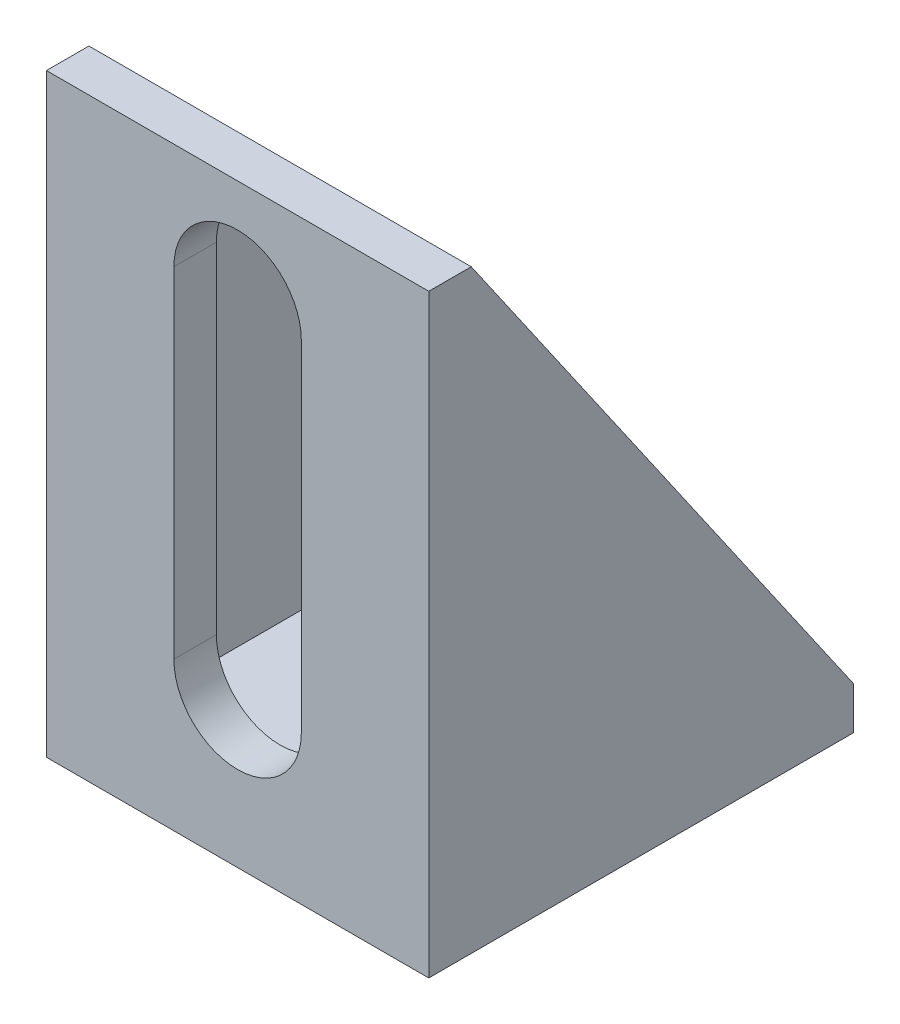
ISO-10303-21;
HEADER;
FILE_DESCRIPTION(('STEP AP214'),'2;1');
FILE_NAME('part.step','',(''),(''),'','','');
FILE_SCHEMA(('AUTOMOTIVE_DESIGN { 1 0 10303 214 1 1 1 1 }'));
ENDSEC;
DATA;
#1=APPLICATION_CONTEXT('core data for automotive mechanical design processes');
#2=APPLICATION_PROTOCOL_DEFINITION('international standard','automotive_design',2000,#1);
#3=PRODUCT_CONTEXT('',#1,'mechanical');
#4=PRODUCT('Part','Part','',(#3));
#5=PRODUCT_RELATED_PRODUCT_CATEGORY('part','',(#4));
#6=PRODUCT_DEFINITION_FORMATION('','',#4);
#7=PRODUCT_DEFINITION_CONTEXT('part definition',#1,'design');
#8=PRODUCT_DEFINITION('design','',#6,#7);
#9=PRODUCT_DEFINITION_SHAPE('','',#8);
#10=(LENGTH_UNIT() NAMED_UNIT(*) SI_UNIT(.MILLI.,.METRE.));
#11=(NAMED_UNIT(*) PLANE_ANGLE_UNIT() SI_UNIT($,.RADIAN.));
#12=(NAMED_UNIT(*) SI_UNIT($,.STERADIAN.) SOLID_ANGLE_UNIT());
#13=UNCERTAINTY_MEASURE_WITH_UNIT(LENGTH_MEASURE(1.E-05),#10,'distance_accuracy_value','');
#14=(GEOMETRIC_REPRESENTATION_CONTEXT(3) GLOBAL_UNCERTAINTY_ASSIGNED_CONTEXT((#13)) GLOBAL_UNIT_ASSIGNED_CONTEXT((#10,
#11,#12)) REPRESENTATION_CONTEXT('',''));
#15=CARTESIAN_POINT('',(0.,0.,0.));
#16=DIRECTION('',(0.,0.,1.));
#17=DIRECTION('',(1.,0.,0.));
#18=AXIS2_PLACEMENT_3D('',#15,#16,#17);
#19=CARTESIAN_POINT('',(18.,2.,-20.));
#20=DIRECTION('',(0.,-0.569209978830308,0.822192191643779));
#21=DIRECTION('',(0.,-0.822192191643779,-0.569209978830308));
#22=AXIS2_PLACEMENT_3D('',#19,#20,#21);
#23=PLANE('',#22);
#24=DIRECTION('',(-1.,0.,0.));
#25=VECTOR('',#24,1.);
#26=CARTESIAN_POINT('',(18.,2.,-20.));
#27=LINE('',#26,#25);
#28=CARTESIAN_POINT('',(18.,2.,-20.));
#29=VERTEX_POINT('',#28);
#30=CARTESIAN_POINT('',(16.,2.,-20.));
#31=VERTEX_POINT('',#30);
#32=EDGE_CURVE('E212',#29,#31,#27,.T.);
#33=ORIENTED_EDGE('',*,*,#32,.T.);
#34=DIRECTION('',(0.,0.822192191643779,0.569209978830308));
#35=VECTOR('',#34,1.);
#36=CARTESIAN_POINT('',(16.,2.,-20.));
#37=LINE('',#36,#35);
#38=CARTESIAN_POINT('',(16.,28.,-2.));
#39=VERTEX_POINT('',#38);
#40=EDGE_CURVE('E11',#31,#39,#37,.T.);
#41=ORIENTED_EDGE('',*,*,#40,.T.);
#42=DIRECTION('',(-1.,0.,0.));
#43=VECTOR('',#42,1.);
#44=CARTESIAN_POINT('',(18.,28.,-2.));
#45=LINE('',#44,#43);
#46=CARTESIAN_POINT('',(18.,28.,-2.));
#47=VERTEX_POINT('',#46);
#48=EDGE_CURVE('E208',#47,#39,#45,.T.);
#49=ORIENTED_EDGE('',*,*,#48,.F.);
#50=DIRECTION('',(0.,0.822192191643779,0.569209978830308));
#51=VECTOR('',#50,1.);
#52=CARTESIAN_POINT('',(18.,2.,-20.));
#53=LINE('',#52,#51);
#54=EDGE_CURVE('E189',#29,#47,#53,.T.);
#55=ORIENTED_EDGE('',*,*,#54,.F.);
#56=EDGE_LOOP('',(#33,#41,#49,#55));
#57=FACE_BOUND('',#56,.T.);
#58=ADVANCED_FACE('F35',(#57),#23,.F.);
#59=CARTESIAN_POINT('',(18.,28.,0.));
#60=DIRECTION('',(0.,0.,-1.));
#61=DIRECTION('',(0.,1.,0.));
#62=AXIS2_PLACEMENT_3D('',#59,#60,#61);
#63=PLANE('',#62);
#64=DIRECTION('',(0.,1.,0.));
#65=VECTOR('',#64,1.);
#66=CARTESIAN_POINT('',(6.,28.,0.));
#67=LINE('',#66,#65);
#68=CARTESIAN_POINT('',(6.,7.,0.));
#69=VERTEX_POINT('',#68);
#70=CARTESIAN_POINT('',(6.,23.,0.));
#71=VERTEX_POINT('',#70);
#72=EDGE_CURVE('E155',#69,#71,#67,.T.);
#73=ORIENTED_EDGE('',*,*,#72,.T.);
#74=CARTESIAN_POINT('',(9.,23.,0.));
#75=DIRECTION('',(0.,0.,-1.));
#76=DIRECTION('',(0.,1.,0.));
#77=AXIS2_PLACEMENT_3D('',#74,#75,#76);
#78=CIRCLE('',#77,3.);
#79=CARTESIAN_POINT('',(12.,23.,0.));
#80=VERTEX_POINT('',#79);
#81=EDGE_CURVE('E158',#71,#80,#78,.T.);
#82=ORIENTED_EDGE('',*,*,#81,.T.);
#83=DIRECTION('',(0.,-1.,0.));
#84=VECTOR('',#83,1.);
#85=CARTESIAN_POINT('',(12.,28.,0.));
#86=LINE('',#85,#84);
#87=CARTESIAN_POINT('',(12.,7.,0.));
#88=VERTEX_POINT('',#87);
#89=EDGE_CURVE('E150',#80,#88,#86,.T.);
#90=ORIENTED_EDGE('',*,*,#89,.T.);
#91=CARTESIAN_POINT('',(9.,7.,0.));
#92=DIRECTION('',(0.,0.,-1.));
#93=DIRECTION('',(0.,1.,0.));
#94=AXIS2_PLACEMENT_3D('',#91,#92,#93);
#95=CIRCLE('',#94,3.);
#96=EDGE_CURVE('E130',#88,#69,#95,.T.);
#97=ORIENTED_EDGE('',*,*,#96,.T.);
#98=EDGE_LOOP('',(#73,#82,#90,#97));
#99=FACE_BOUND('',#98,.T.);
#100=DIRECTION('',(0.,-1.,0.));
#101=VECTOR('',#100,1.);
#102=CARTESIAN_POINT('',(0.,28.,0.));
#103=LINE('',#102,#101);
#104=CARTESIAN_POINT('',(0.,28.,0.));
#105=VERTEX_POINT('',#104);
#106=CARTESIAN_POINT('',(0.,0.,0.));
#107=VERTEX_POINT('',#106);
#108=EDGE_CURVE('E178',#105,#107,#103,.T.);
#109=ORIENTED_EDGE('',*,*,#108,.T.);
#110=DIRECTION('',(-1.,0.,0.));
#111=VECTOR('',#110,1.);
#112=CARTESIAN_POINT('',(18.,0.,0.));
#113=LINE('',#112,#111);
#114=CARTESIAN_POINT('',(18.,0.,0.));
#115=VERTEX_POINT('',#114);
#116=EDGE_CURVE('E218',#115,#107,#113,.T.);
#117=ORIENTED_EDGE('',*,*,#116,.F.);
#118=DIRECTION('',(0.,-1.,0.));
#119=VECTOR('',#118,1.);
#120=CARTESIAN_POINT('',(18.,28.,0.));
#121=LINE('',#120,#119);
#122=CARTESIAN_POINT('',(18.,28.,0.));
#123=VERTEX_POINT('',#122);
#124=EDGE_CURVE('E181',#123,#115,#121,.T.);
#125=ORIENTED_EDGE('',*,*,#124,.F.);
#126=DIRECTION('',(-1.,0.,0.));
#127=VECTOR('',#126,1.);
#128=CARTESIAN_POINT('',(18.,28.,0.));
#129=LINE('',#128,#127);
#130=EDGE_CURVE('E193',#123,#105,#129,.T.);
#131=ORIENTED_EDGE('',*,*,#130,.T.);
#132=EDGE_LOOP('',(#109,#117,#125,#131));
#133=FACE_BOUND('',#132,.T.);
#134=ADVANCED_FACE('F37',(#99,#133),#63,.F.);
#135=CARTESIAN_POINT('',(18.,0.,0.));
#136=DIRECTION('',(0.,1.,0.));
#137=DIRECTION('',(0.,0.,1.));
#138=AXIS2_PLACEMENT_3D('',#135,#136,#137);
#139=PLANE('',#138);
#140=CARTESIAN_POINT('',(9.,0.,-11.));
#141=DIRECTION('',(0.,1.,0.));
#142=DIRECTION('',(0.,0.,1.));
#143=AXIS2_PLACEMENT_3D('',#140,#141,#142);
#144=CIRCLE('',#143,3.);
#145=CARTESIAN_POINT('',(9.,0.,-8.));
#146=VERTEX_POINT('',#145);
#147=EDGE_CURVE('E292',#146,#146,#144,.T.);
#148=ORIENTED_EDGE('',*,*,#147,.T.);
#149=EDGE_LOOP('',(#148));
#150=FACE_BOUND('',#149,.T.);
#151=DIRECTION('',(0.,0.,-1.));
#152=VECTOR('',#151,1.);
#153=CARTESIAN_POINT('',(0.,0.,0.));
#154=LINE('',#153,#152);
#155=CARTESIAN_POINT('',(0.,0.,-20.));
#156=VERTEX_POINT('',#155);
#157=EDGE_CURVE('E196',#107,#156,#154,.T.);
#158=ORIENTED_EDGE('',*,*,#157,.T.);
#159=DIRECTION('',(-1.,0.,0.));
#160=VECTOR('',#159,1.);
#161=CARTESIAN_POINT('',(18.,0.,-20.));
#162=LINE('',#161,#160);
#163=CARTESIAN_POINT('',(18.,0.,-20.));
#164=VERTEX_POINT('',#163);
#165=EDGE_CURVE('E215',#164,#156,#162,.T.);
#166=ORIENTED_EDGE('',*,*,#165,.F.);
#167=DIRECTION('',(0.,0.,-1.));
#168=VECTOR('',#167,1.);
#169=CARTESIAN_POINT('',(18.,0.,0.));
#170=LINE('',#169,#168);
#171=EDGE_CURVE('E184',#115,#164,#170,.T.);
#172=ORIENTED_EDGE('',*,*,#171,.F.);
#173=ORIENTED_EDGE('',*,*,#116,.T.);
#174=EDGE_LOOP('',(#158,#166,#172,#173));
#175=FACE_BOUND('',#174,.T.);
#176=ADVANCED_FACE('F274',(#150,#175),#139,.F.);
#177=CARTESIAN_POINT('',(18.,0.,-20.));
#178=DIRECTION('',(0.,0.,1.));
#179=DIRECTION('',(1.,0.,0.));
#180=AXIS2_PLACEMENT_3D('',#177,#178,#179);
#181=PLANE('',#180);
#182=DIRECTION('',(0.,1.,0.));
#183=VECTOR('',#182,1.);
#184=CARTESIAN_POINT('',(0.,0.,-20.));
#185=LINE('',#184,#183);
#186=CARTESIAN_POINT('',(0.,2.,-20.));
#187=VERTEX_POINT('',#186);
#188=EDGE_CURVE('E198',#156,#187,#185,.T.);
#189=ORIENTED_EDGE('',*,*,#188,.T.);
#190=CARTESIAN_POINT('',(2.,2.,-20.));
#191=VERTEX_POINT('',#190);
#192=EDGE_CURVE('E211',#191,#187,#27,.T.);
#193=ORIENTED_EDGE('',*,*,#192,.F.);
#194=DIRECTION('',(-1.,0.,0.));
#195=VECTOR('',#194,1.);
#196=CARTESIAN_POINT('',(16.,2.,-20.));
#197=LINE('',#196,#195);
#198=EDGE_CURVE('E161',#31,#191,#197,.T.);
#199=ORIENTED_EDGE('',*,*,#198,.F.);
#200=ORIENTED_EDGE('',*,*,#32,.F.);
#201=DIRECTION('',(0.,1.,0.));
#202=VECTOR('',#201,1.);
#203=CARTESIAN_POINT('',(18.,0.,-20.));
#204=LINE('',#203,#202);
#205=EDGE_CURVE('E187',#164,#29,#204,.T.);
#206=ORIENTED_EDGE('',*,*,#205,.F.);
#207=ORIENTED_EDGE('',*,*,#165,.T.);
#208=EDGE_LOOP('',(#189,#193,#199,#200,#206,#207));
#209=FACE_BOUND('',#208,.T.);
#210=ADVANCED_FACE('F231',(#209),#181,.F.);
#211=CARTESIAN_POINT('',(2.,28.,-2.));
#212=VERTEX_POINT('',#211);
#213=CARTESIAN_POINT('',(0.,28.,-2.));
#214=VERTEX_POINT('',#213);
#215=EDGE_CURVE('E207',#212,#214,#45,.T.);
#216=ORIENTED_EDGE('',*,*,#215,.F.);
#217=DIRECTION('',(0.,-0.822192191643779,-0.569209978830308));
#218=VECTOR('',#217,1.);
#219=CARTESIAN_POINT('',(2.,2.,-20.));
#220=LINE('',#219,#218);
#221=EDGE_CURVE('E43',#212,#191,#220,.T.);
#222=ORIENTED_EDGE('',*,*,#221,.T.);
#223=ORIENTED_EDGE('',*,*,#192,.T.);
#224=DIRECTION('',(0.,0.822192191643779,0.569209978830308));
#225=VECTOR('',#224,1.);
#226=CARTESIAN_POINT('',(0.,2.,-20.));
#227=LINE('',#226,#225);
#228=EDGE_CURVE('E201',#187,#214,#227,.T.);
#229=ORIENTED_EDGE('',*,*,#228,.T.);
#230=EDGE_LOOP('',(#216,#222,#223,#229));
#231=FACE_BOUND('',#230,.T.);
#232=ADVANCED_FACE('F225',(#231),#23,.F.);
#233=CARTESIAN_POINT('',(18.,28.,-2.));
#234=DIRECTION('',(0.,-1.,0.));
#235=DIRECTION('',(0.,0.,-1.));
#236=AXIS2_PLACEMENT_3D('',#233,#234,#235);
#237=PLANE('',#236);
#238=DIRECTION('',(0.,0.,1.));
#239=VECTOR('',#238,1.);
#240=CARTESIAN_POINT('',(0.,28.,-2.));
#241=LINE('',#240,#239);
#242=EDGE_CURVE('E185',#214,#105,#241,.T.);
#243=ORIENTED_EDGE('',*,*,#242,.T.);
#244=ORIENTED_EDGE('',*,*,#130,.F.);
#245=DIRECTION('',(0.,0.,1.));
#246=VECTOR('',#245,1.);
#247=CARTESIAN_POINT('',(18.,28.,-2.));
#248=LINE('',#247,#246);
#249=EDGE_CURVE('E191',#47,#123,#248,.T.);
#250=ORIENTED_EDGE('',*,*,#249,.F.);
#251=ORIENTED_EDGE('',*,*,#48,.T.);
#252=DIRECTION('',(1.,0.,0.));
#253=VECTOR('',#252,1.);
#254=CARTESIAN_POINT('',(16.,28.,-2.));
#255=LINE('',#254,#253);
#256=EDGE_CURVE('E170',#212,#39,#255,.T.);
#257=ORIENTED_EDGE('',*,*,#256,.F.);
#258=ORIENTED_EDGE('',*,*,#215,.T.);
#259=EDGE_LOOP('',(#243,#244,#250,#251,#257,#258));
#260=FACE_BOUND('',#259,.T.);
#261=ADVANCED_FACE('F243',(#260),#237,.F.);
#262=CARTESIAN_POINT('',(18.,0.,0.));
#263=DIRECTION('',(1.,0.,0.));
#264=DIRECTION('',(0.,0.,-1.));
#265=AXIS2_PLACEMENT_3D('',#262,#263,#264);
#266=PLANE('',#265);
#267=ORIENTED_EDGE('',*,*,#124,.T.);
#268=ORIENTED_EDGE('',*,*,#171,.T.);
#269=ORIENTED_EDGE('',*,*,#205,.T.);
#270=ORIENTED_EDGE('',*,*,#54,.T.);
#271=ORIENTED_EDGE('',*,*,#249,.T.);
#272=EDGE_LOOP('',(#267,#268,#269,#270,#271));
#273=FACE_BOUND('',#272,.T.);
#274=ADVANCED_FACE('F249',(#273),#266,.T.);
#275=CARTESIAN_POINT('',(0.,0.,0.));
#276=DIRECTION('',(1.,0.,0.));
#277=DIRECTION('',(0.,0.,-1.));
#278=AXIS2_PLACEMENT_3D('',#275,#276,#277);
#279=PLANE('',#278);
#280=ORIENTED_EDGE('',*,*,#108,.F.);
#281=ORIENTED_EDGE('',*,*,#242,.F.);
#282=ORIENTED_EDGE('',*,*,#228,.F.);
#283=ORIENTED_EDGE('',*,*,#188,.F.);
#284=ORIENTED_EDGE('',*,*,#157,.F.);
#285=EDGE_LOOP('',(#280,#281,#282,#283,#284));
#286=FACE_BOUND('',#285,.T.);
#287=ADVANCED_FACE('F240',(#286),#279,.F.);
#288=CARTESIAN_POINT('',(16.,2.,-2.));
#289=DIRECTION('',(1.,0.,0.));
#290=DIRECTION('',(0.,0.,-1.));
#291=AXIS2_PLACEMENT_3D('',#288,#289,#290);
#292=PLANE('',#291);
#293=DIRECTION('',(0.,0.,-1.));
#294=VECTOR('',#293,1.);
#295=CARTESIAN_POINT('',(16.,2.,-2.));
#296=LINE('',#295,#294);
#297=CARTESIAN_POINT('',(16.,2.,-2.));
#298=VERTEX_POINT('',#297);
#299=EDGE_CURVE('E173',#298,#31,#296,.T.);
#300=ORIENTED_EDGE('',*,*,#299,.F.);
#301=DIRECTION('',(0.,-1.,0.));
#302=VECTOR('',#301,1.);
#303=CARTESIAN_POINT('',(16.,2.,-2.));
#304=LINE('',#303,#302);
#305=EDGE_CURVE('E162',#39,#298,#304,.T.);
#306=ORIENTED_EDGE('',*,*,#305,.F.);
#307=ORIENTED_EDGE('',*,*,#40,.F.);
#308=EDGE_LOOP('',(#300,#306,#307));
#309=FACE_BOUND('',#308,.T.);
#310=ADVANCED_FACE('F254',(#309),#292,.F.);
#311=CARTESIAN_POINT('',(2.,2.,-2.));
#312=DIRECTION('',(-1.,0.,0.));
#313=DIRECTION('',(0.,-1.,0.));
#314=AXIS2_PLACEMENT_3D('',#311,#312,#313);
#315=PLANE('',#314);
#316=DIRECTION('',(0.,1.,0.));
#317=VECTOR('',#316,1.);
#318=CARTESIAN_POINT('',(2.,2.,-2.));
#319=LINE('',#318,#317);
#320=CARTESIAN_POINT('',(2.,2.,-2.));
#321=VERTEX_POINT('',#320);
#322=EDGE_CURVE('E168',#321,#212,#319,.T.);
#323=ORIENTED_EDGE('',*,*,#322,.F.);
#324=DIRECTION('',(0.,0.,-1.));
#325=VECTOR('',#324,1.);
#326=CARTESIAN_POINT('',(2.,2.,-2.));
#327=LINE('',#326,#325);
#328=EDGE_CURVE('E176',#321,#191,#327,.T.);
#329=ORIENTED_EDGE('',*,*,#328,.T.);
#330=ORIENTED_EDGE('',*,*,#221,.F.);
#331=EDGE_LOOP('',(#323,#329,#330));
#332=FACE_BOUND('',#331,.T.);
#333=ADVANCED_FACE('F258',(#332),#315,.F.);
#334=CARTESIAN_POINT('',(16.,2.,-2.));
#335=DIRECTION('',(0.,-1.,0.));
#336=DIRECTION('',(0.,0.,-1.));
#337=AXIS2_PLACEMENT_3D('',#334,#335,#336);
#338=PLANE('',#337);
#339=CARTESIAN_POINT('',(9.,2.,-11.));
#340=DIRECTION('',(0.,1.,0.));
#341=DIRECTION('',(0.,0.,1.));
#342=AXIS2_PLACEMENT_3D('',#339,#340,#341);
#343=CIRCLE('',#342,3.);
#344=CARTESIAN_POINT('',(9.,2.,-8.));
#345=VERTEX_POINT('',#344);
#346=EDGE_CURVE('E294',#345,#345,#343,.T.);
#347=ORIENTED_EDGE('',*,*,#346,.F.);
#348=EDGE_LOOP('',(#347));
#349=FACE_BOUND('',#348,.T.);
#350=ORIENTED_EDGE('',*,*,#198,.T.);
#351=ORIENTED_EDGE('',*,*,#328,.F.);
#352=DIRECTION('',(-1.,0.,0.));
#353=VECTOR('',#352,1.);
#354=CARTESIAN_POINT('',(16.,2.,-2.));
#355=LINE('',#354,#353);
#356=EDGE_CURVE('E165',#298,#321,#355,.T.);
#357=ORIENTED_EDGE('',*,*,#356,.F.);
#358=ORIENTED_EDGE('',*,*,#299,.T.);
#359=EDGE_LOOP('',(#350,#351,#357,#358));
#360=FACE_BOUND('',#359,.T.);
#361=ADVANCED_FACE('F257',(#349,#360),#338,.F.);
#362=CARTESIAN_POINT('',(0.,0.,-2.));
#363=DIRECTION('',(0.,0.,1.));
#364=DIRECTION('',(1.,0.,0.));
#365=AXIS2_PLACEMENT_3D('',#362,#363,#364);
#366=PLANE('',#365);
#367=DIRECTION('',(0.,-1.,0.));
#368=VECTOR('',#367,1.);
#369=CARTESIAN_POINT('',(12.,23.,-2.));
#370=LINE('',#369,#368);
#371=CARTESIAN_POINT('',(12.,23.,-2.));
#372=VERTEX_POINT('',#371);
#373=CARTESIAN_POINT('',(12.,7.,-2.));
#374=VERTEX_POINT('',#373);
#375=EDGE_CURVE('E136',#372,#374,#370,.T.);
#376=ORIENTED_EDGE('',*,*,#375,.F.);
#377=CARTESIAN_POINT('',(9.,23.,-2.));
#378=DIRECTION('',(0.,0.,-1.));
#379=DIRECTION('',(-1.,0.,0.));
#380=AXIS2_PLACEMENT_3D('',#377,#378,#379);
#381=CIRCLE('',#380,3.);
#382=CARTESIAN_POINT('',(6.,23.,-2.));
#383=VERTEX_POINT('',#382);
#384=EDGE_CURVE('E58',#383,#372,#381,.T.);
#385=ORIENTED_EDGE('',*,*,#384,.F.);
#386=DIRECTION('',(0.,1.,0.));
#387=VECTOR('',#386,1.);
#388=CARTESIAN_POINT('',(6.,23.,-2.));
#389=LINE('',#388,#387);
#390=CARTESIAN_POINT('',(6.,7.,-2.));
#391=VERTEX_POINT('',#390);
#392=EDGE_CURVE('E143',#391,#383,#389,.T.);
#393=ORIENTED_EDGE('',*,*,#392,.F.);
#394=CARTESIAN_POINT('',(9.,7.,-2.));
#395=DIRECTION('',(0.,0.,-1.));
#396=DIRECTION('',(-1.,0.,0.));
#397=AXIS2_PLACEMENT_3D('',#394,#395,#396);
#398=CIRCLE('',#397,3.);
#399=EDGE_CURVE('E127',#374,#391,#398,.T.);
#400=ORIENTED_EDGE('',*,*,#399,.F.);
#401=EDGE_LOOP('',(#376,#385,#393,#400));
#402=FACE_BOUND('',#401,.T.);
#403=ORIENTED_EDGE('',*,*,#305,.T.);
#404=ORIENTED_EDGE('',*,*,#356,.T.);
#405=ORIENTED_EDGE('',*,*,#322,.T.);
#406=ORIENTED_EDGE('',*,*,#256,.T.);
#407=EDGE_LOOP('',(#403,#404,#405,#406));
#408=FACE_BOUND('',#407,.T.);
#409=ADVANCED_FACE('F140',(#402,#408),#366,.F.);
#410=CARTESIAN_POINT('',(9.,23.,16.));
#411=DIRECTION('',(0.,0.,-1.));
#412=DIRECTION('',(-1.,0.,0.));
#413=AXIS2_PLACEMENT_3D('',#410,#411,#412);
#414=CYLINDRICAL_SURFACE('',#413,3.);
#415=DIRECTION('',(0.,0.,-1.));
#416=VECTOR('',#415,1.);
#417=CARTESIAN_POINT('',(6.,23.,16.));
#418=LINE('',#417,#416);
#419=EDGE_CURVE('E148',#71,#383,#418,.T.);
#420=ORIENTED_EDGE('',*,*,#419,.T.);
#421=ORIENTED_EDGE('',*,*,#384,.T.);
#422=DIRECTION('',(0.,0.,-1.));
#423=VECTOR('',#422,1.);
#424=CARTESIAN_POINT('',(12.,23.,16.));
#425=LINE('',#424,#423);
#426=EDGE_CURVE('E133',#80,#372,#425,.T.);
#427=ORIENTED_EDGE('',*,*,#426,.F.);
#428=ORIENTED_EDGE('',*,*,#81,.F.);
#429=EDGE_LOOP('',(#420,#421,#427,#428));
#430=FACE_BOUND('',#429,.T.);
#431=ADVANCED_FACE('F311',(#430),#414,.F.);
#432=CARTESIAN_POINT('',(6.,23.,16.));
#433=DIRECTION('',(-1.,0.,0.));
#434=DIRECTION('',(0.,-1.,0.));
#435=AXIS2_PLACEMENT_3D('',#432,#433,#434);
#436=PLANE('',#435);
#437=DIRECTION('',(0.,0.,-1.));
#438=VECTOR('',#437,1.);
#439=CARTESIAN_POINT('',(6.,7.,16.));
#440=LINE('',#439,#438);
#441=EDGE_CURVE('E132',#69,#391,#440,.T.);
#442=ORIENTED_EDGE('',*,*,#441,.T.);
#443=ORIENTED_EDGE('',*,*,#392,.T.);
#444=ORIENTED_EDGE('',*,*,#419,.F.);
#445=ORIENTED_EDGE('',*,*,#72,.F.);
#446=EDGE_LOOP('',(#442,#443,#444,#445));
#447=FACE_BOUND('',#446,.T.);
#448=ADVANCED_FACE('F308',(#447),#436,.F.);
#449=CARTESIAN_POINT('',(9.,7.,16.));
#450=DIRECTION('',(0.,0.,-1.));
#451=DIRECTION('',(-1.,0.,0.));
#452=AXIS2_PLACEMENT_3D('',#449,#450,#451);
#453=CYLINDRICAL_SURFACE('',#452,3.);
#454=DIRECTION('',(0.,0.,-1.));
#455=VECTOR('',#454,1.);
#456=CARTESIAN_POINT('',(12.,7.,16.));
#457=LINE('',#456,#455);
#458=EDGE_CURVE('E50',#88,#374,#457,.T.);
#459=ORIENTED_EDGE('',*,*,#458,.T.);
#460=ORIENTED_EDGE('',*,*,#399,.T.);
#461=ORIENTED_EDGE('',*,*,#441,.F.);
#462=ORIENTED_EDGE('',*,*,#96,.F.);
#463=EDGE_LOOP('',(#459,#460,#461,#462));
#464=FACE_BOUND('',#463,.T.);
#465=ADVANCED_FACE('F124',(#464),#453,.F.);
#466=CARTESIAN_POINT('',(12.,23.,16.));
#467=DIRECTION('',(1.,0.,0.));
#468=DIRECTION('',(0.,1.,0.));
#469=AXIS2_PLACEMENT_3D('',#466,#467,#468);
#470=PLANE('',#469);
#471=ORIENTED_EDGE('',*,*,#426,.T.);
#472=ORIENTED_EDGE('',*,*,#375,.T.);
#473=ORIENTED_EDGE('',*,*,#458,.F.);
#474=ORIENTED_EDGE('',*,*,#89,.F.);
#475=EDGE_LOOP('',(#471,#472,#473,#474));
#476=FACE_BOUND('',#475,.T.);
#477=ADVANCED_FACE('F137',(#476),#470,.F.);
#478=CARTESIAN_POINT('',(9.,-16.,-11.));
#479=DIRECTION('',(0.,1.,0.));
#480=DIRECTION('',(0.,0.,1.));
#481=AXIS2_PLACEMENT_3D('',#478,#479,#480);
#482=CYLINDRICAL_SURFACE('',#481,3.);
#483=ORIENTED_EDGE('',*,*,#346,.T.);
#484=EDGE_LOOP('',(#483));
#485=FACE_BOUND('',#484,.T.);
#486=ORIENTED_EDGE('',*,*,#147,.F.);
#487=EDGE_LOOP('',(#486));
#488=FACE_BOUND('',#487,.T.);
#489=ADVANCED_FACE('F300',(#485,#488),#482,.F.);
#490=CLOSED_SHELL('',(#58,#134,#176,#210,#232,#261,#274,#287,#310,#333,#361,#409,#431,#448,#465,
#477,#489));
#491=MANIFOLD_SOLID_BREP('B2',#490);
#492=ADVANCED_BREP_SHAPE_REPRESENTATION('',(#18,#491),#14);
#493=SHAPE_DEFINITION_REPRESENTATION(#9,#492);
ENDSEC;
END-ISO-10303-21;
